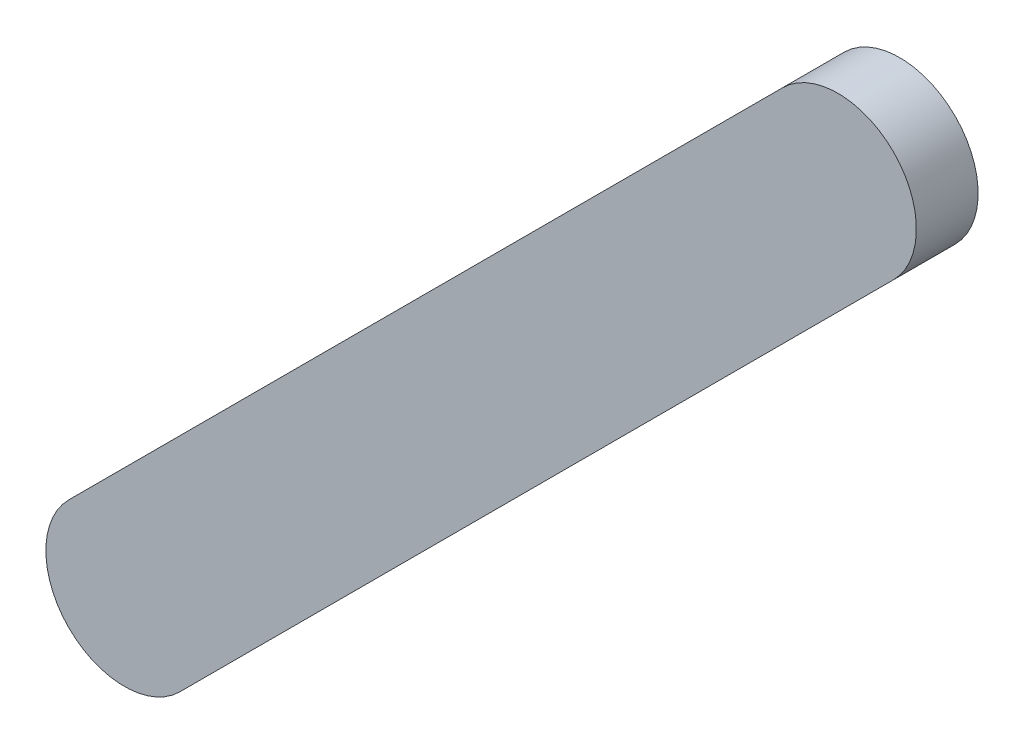
ISO-10303-21;
HEADER;
FILE_DESCRIPTION(('STEP AP214'),'2;1');
FILE_NAME('part.step','',(''),(''),'','','');
FILE_SCHEMA(('AUTOMOTIVE_DESIGN { 1 0 10303 214 1 1 1 1 }'));
ENDSEC;
DATA;
#1=APPLICATION_CONTEXT('core data for automotive mechanical design processes');
#2=APPLICATION_PROTOCOL_DEFINITION('international standard','automotive_design',2000,#1);
#3=PRODUCT_CONTEXT('',#1,'mechanical');
#4=PRODUCT('Part','Part','',(#3));
#5=PRODUCT_RELATED_PRODUCT_CATEGORY('part','',(#4));
#6=PRODUCT_DEFINITION_FORMATION('','',#4);
#7=PRODUCT_DEFINITION_CONTEXT('part definition',#1,'design');
#8=PRODUCT_DEFINITION('design','',#6,#7);
#9=PRODUCT_DEFINITION_SHAPE('','',#8);
#10=(LENGTH_UNIT() NAMED_UNIT(*) SI_UNIT(.MILLI.,.METRE.));
#11=(NAMED_UNIT(*) PLANE_ANGLE_UNIT() SI_UNIT($,.RADIAN.));
#12=(NAMED_UNIT(*) SI_UNIT($,.STERADIAN.) SOLID_ANGLE_UNIT());
#13=UNCERTAINTY_MEASURE_WITH_UNIT(LENGTH_MEASURE(1.E-05),#10,'distance_accuracy_value','');
#14=(GEOMETRIC_REPRESENTATION_CONTEXT(3) GLOBAL_UNCERTAINTY_ASSIGNED_CONTEXT((#13)) GLOBAL_UNIT_ASSIGNED_CONTEXT((#10,
#11,#12)) REPRESENTATION_CONTEXT('',''));
#15=CARTESIAN_POINT('',(0.,0.,0.));
#16=DIRECTION('',(0.,0.,1.));
#17=DIRECTION('',(1.,0.,0.));
#18=AXIS2_PLACEMENT_3D('',#15,#16,#17);
#19=CARTESIAN_POINT('',(152.30020594,51.50939406,0.));
#20=DIRECTION('',(-0.707106781186544,0.707106781186551,0.));
#21=DIRECTION('',(0.707106781186551,0.707106781186544,0.));
#22=AXIS2_PLACEMENT_3D('',#19,#20,#21);
#23=PLANE('',#22);
#24=DIRECTION('',(0.707106781186551,0.707106781186544,0.));
#25=VECTOR('',#24,1.);
#26=CARTESIAN_POINT('',(152.30020594,51.50939406,0.1999996));
#27=LINE('',#26,#25);
#28=CARTESIAN_POINT('',(152.30020594,51.50939406,0.1999996));
#29=VERTEX_POINT('',#28);
#30=CARTESIAN_POINT('',(154.61160594,53.82079406,0.1999996));
#31=VERTEX_POINT('',#30);
#32=EDGE_CURVE('E11',#29,#31,#27,.T.);
#33=ORIENTED_EDGE('',*,*,#32,.F.);
#34=DIRECTION('',(0.,0.,1.));
#35=VECTOR('',#34,1.);
#36=CARTESIAN_POINT('',(152.30020594,51.50939406,0.));
#37=LINE('',#36,#35);
#38=CARTESIAN_POINT('',(152.30020594,51.50939406,0.));
#39=VERTEX_POINT('',#38);
#40=EDGE_CURVE('E24',#39,#29,#37,.T.);
#41=ORIENTED_EDGE('',*,*,#40,.F.);
#42=DIRECTION('',(0.707106781186551,0.707106781186544,0.));
#43=VECTOR('',#42,1.);
#44=CARTESIAN_POINT('',(152.30020594,51.50939406,0.));
#45=LINE('',#44,#43);
#46=CARTESIAN_POINT('',(154.61160594,53.82079406,0.));
#47=VERTEX_POINT('',#46);
#48=EDGE_CURVE('E75',#39,#47,#45,.T.);
#49=ORIENTED_EDGE('',*,*,#48,.T.);
#50=DIRECTION('',(0.,0.,1.));
#51=VECTOR('',#50,1.);
#52=CARTESIAN_POINT('',(154.61160594,53.82079406,0.));
#53=LINE('',#52,#51);
#54=EDGE_CURVE('E37',#47,#31,#53,.T.);
#55=ORIENTED_EDGE('',*,*,#54,.T.);
#56=EDGE_LOOP('',(#33,#41,#49,#55));
#57=FACE_BOUND('',#56,.T.);
#58=ADVANCED_FACE('F17',(#57),#23,.F.);
#59=CARTESIAN_POINT('',(154.432,54.0004,0.));
#60=DIRECTION('',(0.,0.,-1.));
#61=DIRECTION('',(0.707106781186576,-0.70710678118652,0.));
#62=AXIS2_PLACEMENT_3D('',#59,#60,#61);
#63=CYLINDRICAL_SURFACE('',#62,0.254001156230781);
#64=CARTESIAN_POINT('',(154.432,54.0004,0.1999996));
#65=DIRECTION('',(0.,0.,1.));
#66=DIRECTION('',(0.707106781186576,-0.70710678118652,0.));
#67=AXIS2_PLACEMENT_3D('',#64,#65,#66);
#68=CIRCLE('',#67,0.254001156230781);
#69=CARTESIAN_POINT('',(154.25239406,54.18000594,0.1999996));
#70=VERTEX_POINT('',#69);
#71=EDGE_CURVE('E83',#31,#70,#68,.T.);
#72=ORIENTED_EDGE('',*,*,#71,.F.);
#73=ORIENTED_EDGE('',*,*,#54,.F.);
#74=CARTESIAN_POINT('',(154.432,54.0004,0.));
#75=DIRECTION('',(0.,0.,1.));
#76=DIRECTION('',(0.707106781186576,-0.70710678118652,0.));
#77=AXIS2_PLACEMENT_3D('',#74,#75,#76);
#78=CIRCLE('',#77,0.254001156230781);
#79=CARTESIAN_POINT('',(154.25239406,54.18000594,0.));
#80=VERTEX_POINT('',#79);
#81=EDGE_CURVE('E81',#47,#80,#78,.T.);
#82=ORIENTED_EDGE('',*,*,#81,.T.);
#83=DIRECTION('',(0.,0.,1.));
#84=VECTOR('',#83,1.);
#85=CARTESIAN_POINT('',(154.25239406,54.18000594,0.));
#86=LINE('',#85,#84);
#87=EDGE_CURVE('E67',#80,#70,#86,.T.);
#88=ORIENTED_EDGE('',*,*,#87,.T.);
#89=EDGE_LOOP('',(#72,#73,#82,#88));
#90=FACE_BOUND('',#89,.T.);
#91=ADVANCED_FACE('F89',(#90),#63,.T.);
#92=CARTESIAN_POINT('',(154.25239406,54.18000594,0.));
#93=DIRECTION('',(0.70710678118655,-0.707106781186545,0.));
#94=DIRECTION('',(-0.707106781186545,-0.70710678118655,0.));
#95=AXIS2_PLACEMENT_3D('',#92,#93,#94);
#96=PLANE('',#95);
#97=DIRECTION('',(-0.707106781186545,-0.70710678118655,0.));
#98=VECTOR('',#97,1.);
#99=CARTESIAN_POINT('',(154.25239406,54.18000594,0.1999996));
#100=LINE('',#99,#98);
#101=CARTESIAN_POINT('',(151.94099406,51.86860594,0.1999996));
#102=VERTEX_POINT('',#101);
#103=EDGE_CURVE('E71',#70,#102,#100,.T.);
#104=ORIENTED_EDGE('',*,*,#103,.F.);
#105=ORIENTED_EDGE('',*,*,#87,.F.);
#106=DIRECTION('',(-0.707106781186545,-0.70710678118655,0.));
#107=VECTOR('',#106,1.);
#108=CARTESIAN_POINT('',(154.25239406,54.18000594,0.));
#109=LINE('',#108,#107);
#110=CARTESIAN_POINT('',(151.94099406,51.86860594,0.));
#111=VERTEX_POINT('',#110);
#112=EDGE_CURVE('E63',#80,#111,#109,.T.);
#113=ORIENTED_EDGE('',*,*,#112,.T.);
#114=DIRECTION('',(0.,0.,1.));
#115=VECTOR('',#114,1.);
#116=CARTESIAN_POINT('',(151.94099406,51.86860594,0.));
#117=LINE('',#116,#115);
#118=EDGE_CURVE('E53',#111,#102,#117,.T.);
#119=ORIENTED_EDGE('',*,*,#118,.T.);
#120=EDGE_LOOP('',(#104,#105,#113,#119));
#121=FACE_BOUND('',#120,.T.);
#122=ADVANCED_FACE('F66',(#121),#96,.F.);
#123=CARTESIAN_POINT('',(152.1206,51.689,0.));
#124=DIRECTION('',(0.,0.,-1.));
#125=DIRECTION('',(-0.70710678118652,0.707106781186576,0.));
#126=AXIS2_PLACEMENT_3D('',#123,#124,#125);
#127=CYLINDRICAL_SURFACE('',#126,0.254001156230764);
#128=CARTESIAN_POINT('',(152.1206,51.689,0.1999996));
#129=DIRECTION('',(0.,0.,1.));
#130=DIRECTION('',(-0.70710678118652,0.707106781186576,0.));
#131=AXIS2_PLACEMENT_3D('',#128,#129,#130);
#132=CIRCLE('',#131,0.254001156230764);
#133=EDGE_CURVE('E59',#102,#29,#132,.T.);
#134=ORIENTED_EDGE('',*,*,#133,.F.);
#135=ORIENTED_EDGE('',*,*,#118,.F.);
#136=CARTESIAN_POINT('',(152.1206,51.689,0.));
#137=DIRECTION('',(0.,0.,1.));
#138=DIRECTION('',(-0.70710678118652,0.707106781186576,0.));
#139=AXIS2_PLACEMENT_3D('',#136,#137,#138);
#140=CIRCLE('',#139,0.254001156230764);
#141=EDGE_CURVE('E57',#111,#39,#140,.T.);
#142=ORIENTED_EDGE('',*,*,#141,.T.);
#143=ORIENTED_EDGE('',*,*,#40,.T.);
#144=EDGE_LOOP('',(#134,#135,#142,#143));
#145=FACE_BOUND('',#144,.T.);
#146=ADVANCED_FACE('F55',(#145),#127,.T.);
#147=CARTESIAN_POINT('',(152.30020594,51.50939406,0.));
#148=DIRECTION('',(0.,0.,-1.));
#149=DIRECTION('',(-1.,0.,0.));
#150=AXIS2_PLACEMENT_3D('',#147,#148,#149);
#151=PLANE('',#150);
#152=ORIENTED_EDGE('',*,*,#141,.F.);
#153=ORIENTED_EDGE('',*,*,#112,.F.);
#154=ORIENTED_EDGE('',*,*,#81,.F.);
#155=ORIENTED_EDGE('',*,*,#48,.F.);
#156=EDGE_LOOP('',(#152,#153,#154,#155));
#157=FACE_BOUND('',#156,.T.);
#158=ADVANCED_FACE('F74',(#157),#151,.T.);
#159=CARTESIAN_POINT('',(152.30020594,51.50939406,0.1999996));
#160=DIRECTION('',(0.,0.,-1.));
#161=DIRECTION('',(-1.,0.,0.));
#162=AXIS2_PLACEMENT_3D('',#159,#160,#161);
#163=PLANE('',#162);
#164=ORIENTED_EDGE('',*,*,#32,.T.);
#165=ORIENTED_EDGE('',*,*,#71,.T.);
#166=ORIENTED_EDGE('',*,*,#103,.T.);
#167=ORIENTED_EDGE('',*,*,#133,.T.);
#168=EDGE_LOOP('',(#164,#165,#166,#167));
#169=FACE_BOUND('',#168,.T.);
#170=ADVANCED_FACE('F91',(#169),#163,.F.);
#171=CLOSED_SHELL('',(#58,#91,#122,#146,#158,#170));
#172=MANIFOLD_SOLID_BREP('B1',#171);
#173=ADVANCED_BREP_SHAPE_REPRESENTATION('',(#18,#172),#14);
#174=SHAPE_DEFINITION_REPRESENTATION(#9,#173);
ENDSEC;
END-ISO-10303-21;
